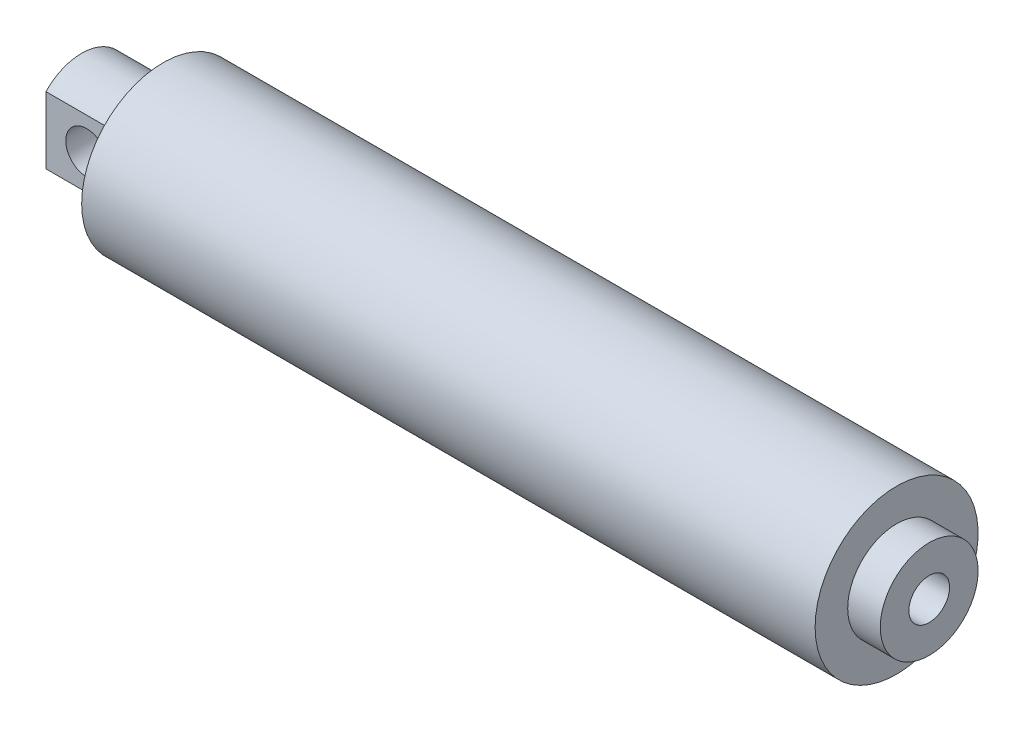
ISO-10303-21;
HEADER;
FILE_DESCRIPTION(('STEP AP214'),'2;1');
FILE_NAME('part.step','',(''),(''),'','','');
FILE_SCHEMA(('AUTOMOTIVE_DESIGN { 1 0 10303 214 1 1 1 1 }'));
ENDSEC;
DATA;
#1=APPLICATION_CONTEXT('core data for automotive mechanical design processes');
#2=APPLICATION_PROTOCOL_DEFINITION('international standard','automotive_design',2000,#1);
#3=PRODUCT_CONTEXT('',#1,'mechanical');
#4=PRODUCT('Part','Part','',(#3));
#5=PRODUCT_RELATED_PRODUCT_CATEGORY('part','',(#4));
#6=PRODUCT_DEFINITION_FORMATION('','',#4);
#7=PRODUCT_DEFINITION_CONTEXT('part definition',#1,'design');
#8=PRODUCT_DEFINITION('design','',#6,#7);
#9=PRODUCT_DEFINITION_SHAPE('','',#8);
#10=(LENGTH_UNIT() NAMED_UNIT(*) SI_UNIT(.MILLI.,.METRE.));
#11=(NAMED_UNIT(*) PLANE_ANGLE_UNIT() SI_UNIT($,.RADIAN.));
#12=(NAMED_UNIT(*) SI_UNIT($,.STERADIAN.) SOLID_ANGLE_UNIT());
#13=UNCERTAINTY_MEASURE_WITH_UNIT(LENGTH_MEASURE(1.E-05),#10,'distance_accuracy_value','');
#14=(GEOMETRIC_REPRESENTATION_CONTEXT(3) GLOBAL_UNCERTAINTY_ASSIGNED_CONTEXT((#13)) GLOBAL_UNIT_ASSIGNED_CONTEXT((#10,
#11,#12)) REPRESENTATION_CONTEXT('',''));
#15=CARTESIAN_POINT('',(0.,0.,0.));
#16=DIRECTION('',(0.,0.,1.));
#17=DIRECTION('',(1.,0.,0.));
#18=AXIS2_PLACEMENT_3D('',#15,#16,#17);
#19=CARTESIAN_POINT('',(-12.7,12.7,0.));
#20=DIRECTION('',(-1.,0.,0.));
#21=DIRECTION('',(0.,0.,1.));
#22=AXIS2_PLACEMENT_3D('',#19,#20,#21);
#23=CYLINDRICAL_SURFACE('',#22,7.62);
#24=DIRECTION('',(-1.,0.,0.));
#25=VECTOR('',#24,1.);
#26=CARTESIAN_POINT('',(-12.7,17.914641496546,-5.55625));
#27=LINE('',#26,#25);
#28=CARTESIAN_POINT('',(-12.7,17.914641496546,-5.55625));
#29=VERTEX_POINT('',#28);
#30=CARTESIAN_POINT('',(0.,17.914641496546,-5.55625));
#31=VERTEX_POINT('',#30);
#32=EDGE_CURVE('E11',#29,#31,#27,.F.);
#33=ORIENTED_EDGE('',*,*,#32,.F.);
#34=CARTESIAN_POINT('',(-12.7,12.7,0.));
#35=DIRECTION('',(-1.,0.,0.));
#36=DIRECTION('',(0.,0.,1.));
#37=AXIS2_PLACEMENT_3D('',#34,#35,#36);
#38=CIRCLE('',#37,7.62);
#39=CARTESIAN_POINT('',(-12.7,17.914641496546,5.55625));
#40=VERTEX_POINT('',#39);
#41=EDGE_CURVE('E90',#40,#29,#38,.T.);
#42=ORIENTED_EDGE('',*,*,#41,.F.);
#43=DIRECTION('',(-1.,0.,0.));
#44=VECTOR('',#43,1.);
#45=CARTESIAN_POINT('',(-12.7,17.914641496546,5.55625));
#46=LINE('',#45,#44);
#47=CARTESIAN_POINT('',(0.,17.914641496546,5.55625));
#48=VERTEX_POINT('',#47);
#49=EDGE_CURVE('E75',#48,#40,#46,.T.);
#50=ORIENTED_EDGE('',*,*,#49,.F.);
#51=CARTESIAN_POINT('',(0.,12.7,0.));
#52=DIRECTION('',(-1.,0.,0.));
#53=DIRECTION('',(0.,0.,1.));
#54=AXIS2_PLACEMENT_3D('',#51,#52,#53);
#55=CIRCLE('',#54,7.62);
#56=EDGE_CURVE('E98',#48,#31,#55,.T.);
#57=ORIENTED_EDGE('',*,*,#56,.T.);
#58=EDGE_LOOP('',(#33,#42,#50,#57));
#59=FACE_BOUND('',#58,.T.);
#60=ADVANCED_FACE('F36',(#59),#23,.T.);
#61=CARTESIAN_POINT('',(-12.7,0.,0.));
#62=DIRECTION('',(-1.,0.,0.));
#63=DIRECTION('',(0.,0.,1.));
#64=AXIS2_PLACEMENT_3D('',#61,#62,#63);
#65=PLANE('',#64);
#66=DIRECTION('',(0.,1.,0.));
#67=VECTOR('',#66,1.);
#68=CARTESIAN_POINT('',(-12.7,20.32,-5.55625));
#69=LINE('',#68,#67);
#70=CARTESIAN_POINT('',(-12.7,7.48535850345395,-5.55625));
#71=VERTEX_POINT('',#70);
#72=EDGE_CURVE('E120',#71,#29,#69,.T.);
#73=ORIENTED_EDGE('',*,*,#72,.F.);
#74=CARTESIAN_POINT('',(-12.7,7.48535850345395,5.55625));
#75=VERTEX_POINT('',#74);
#76=EDGE_CURVE('E92',#71,#75,#38,.T.);
#77=ORIENTED_EDGE('',*,*,#76,.T.);
#78=DIRECTION('',(0.,-1.,0.));
#79=VECTOR('',#78,1.);
#80=CARTESIAN_POINT('',(-12.7,20.32,5.55625));
#81=LINE('',#80,#79);
#82=EDGE_CURVE('E78',#40,#75,#81,.T.);
#83=ORIENTED_EDGE('',*,*,#82,.F.);
#84=ORIENTED_EDGE('',*,*,#41,.T.);
#85=EDGE_LOOP('',(#73,#77,#83,#84));
#86=FACE_BOUND('',#85,.T.);
#87=ADVANCED_FACE('F38',(#86),#65,.T.);
#88=CARTESIAN_POINT('',(119.38,0.,0.));
#89=DIRECTION('',(1.,0.,0.));
#90=DIRECTION('',(0.,0.,-1.));
#91=AXIS2_PLACEMENT_3D('',#88,#89,#90);
#92=PLANE('',#91);
#93=CARTESIAN_POINT('',(119.38,12.7,0.));
#94=DIRECTION('',(1.,0.,0.));
#95=DIRECTION('',(0.,0.,-1.));
#96=AXIS2_PLACEMENT_3D('',#93,#94,#95);
#97=CIRCLE('',#96,3.175);
#98=CARTESIAN_POINT('',(119.38,12.7,-3.175));
#99=VERTEX_POINT('',#98);
#100=EDGE_CURVE('E102',#99,#99,#97,.T.);
#101=ORIENTED_EDGE('',*,*,#100,.F.);
#102=EDGE_LOOP('',(#101));
#103=FACE_BOUND('',#102,.T.);
#104=CARTESIAN_POINT('',(119.38,12.7,0.));
#105=DIRECTION('',(-1.,0.,0.));
#106=DIRECTION('',(0.,0.,1.));
#107=AXIS2_PLACEMENT_3D('',#104,#105,#106);
#108=CIRCLE('',#107,7.62);
#109=CARTESIAN_POINT('',(119.38,12.7,7.62));
#110=VERTEX_POINT('',#109);
#111=EDGE_CURVE('E84',#110,#110,#108,.T.);
#112=ORIENTED_EDGE('',*,*,#111,.F.);
#113=EDGE_LOOP('',(#112));
#114=FACE_BOUND('',#113,.T.);
#115=ADVANCED_FACE('F146',(#103,#114),#92,.T.);
#116=CARTESIAN_POINT('',(-12.7,12.7,0.));
#117=DIRECTION('',(-1.,0.,0.));
#118=DIRECTION('',(0.,0.,1.));
#119=AXIS2_PLACEMENT_3D('',#116,#117,#118);
#120=CYLINDRICAL_SURFACE('',#119,7.62);
#121=ORIENTED_EDGE('',*,*,#111,.T.);
#122=EDGE_LOOP('',(#121));
#123=FACE_BOUND('',#122,.T.);
#124=CARTESIAN_POINT('',(114.3,12.7,0.));
#125=DIRECTION('',(-1.,0.,0.));
#126=DIRECTION('',(0.,0.,1.));
#127=AXIS2_PLACEMENT_3D('',#124,#125,#126);
#128=CIRCLE('',#127,7.62);
#129=CARTESIAN_POINT('',(114.3,12.7,7.62));
#130=VERTEX_POINT('',#129);
#131=EDGE_CURVE('E111',#130,#130,#128,.T.);
#132=ORIENTED_EDGE('',*,*,#131,.F.);
#133=EDGE_LOOP('',(#132));
#134=FACE_BOUND('',#133,.T.);
#135=ADVANCED_FACE('F138',(#123,#134),#120,.T.);
#136=CARTESIAN_POINT('',(114.3,0.,0.));
#137=DIRECTION('',(1.,0.,0.));
#138=DIRECTION('',(0.,0.,-1.));
#139=AXIS2_PLACEMENT_3D('',#136,#137,#138);
#140=PLANE('',#139);
#141=ORIENTED_EDGE('',*,*,#131,.T.);
#142=EDGE_LOOP('',(#141));
#143=FACE_BOUND('',#142,.T.);
#144=CARTESIAN_POINT('',(114.3,12.7,0.));
#145=DIRECTION('',(-1.,0.,0.));
#146=DIRECTION('',(0.,0.,1.));
#147=AXIS2_PLACEMENT_3D('',#144,#145,#146);
#148=CIRCLE('',#147,12.7);
#149=CARTESIAN_POINT('',(114.3,12.7,12.7));
#150=VERTEX_POINT('',#149);
#151=EDGE_CURVE('E108',#150,#150,#148,.T.);
#152=ORIENTED_EDGE('',*,*,#151,.F.);
#153=EDGE_LOOP('',(#152));
#154=FACE_BOUND('',#153,.T.);
#155=ADVANCED_FACE('F132',(#143,#154),#140,.T.);
#156=CARTESIAN_POINT('',(-12.7,12.7,0.));
#157=DIRECTION('',(-1.,0.,0.));
#158=DIRECTION('',(0.,0.,1.));
#159=AXIS2_PLACEMENT_3D('',#156,#157,#158);
#160=CYLINDRICAL_SURFACE('',#159,12.7);
#161=ORIENTED_EDGE('',*,*,#151,.T.);
#162=EDGE_LOOP('',(#161));
#163=FACE_BOUND('',#162,.T.);
#164=CARTESIAN_POINT('',(0.,12.7,0.));
#165=DIRECTION('',(-1.,0.,0.));
#166=DIRECTION('',(0.,0.,1.));
#167=AXIS2_PLACEMENT_3D('',#164,#165,#166);
#168=CIRCLE('',#167,12.7);
#169=CARTESIAN_POINT('',(0.,12.7,12.7));
#170=VERTEX_POINT('',#169);
#171=EDGE_CURVE('E105',#170,#170,#168,.T.);
#172=ORIENTED_EDGE('',*,*,#171,.F.);
#173=EDGE_LOOP('',(#172));
#174=FACE_BOUND('',#173,.T.);
#175=ADVANCED_FACE('F127',(#163,#174),#160,.T.);
#176=CARTESIAN_POINT('',(0.,0.,0.));
#177=DIRECTION('',(-1.,0.,0.));
#178=DIRECTION('',(0.,0.,1.));
#179=AXIS2_PLACEMENT_3D('',#176,#177,#178);
#180=PLANE('',#179);
#181=CARTESIAN_POINT('',(0.,7.48535850345395,-5.55625));
#182=VERTEX_POINT('',#181);
#183=CARTESIAN_POINT('',(0.,7.48535850345395,5.55625));
#184=VERTEX_POINT('',#183);
#185=EDGE_CURVE('E95',#182,#184,#55,.T.);
#186=ORIENTED_EDGE('',*,*,#185,.F.);
#187=DIRECTION('',(0.,1.,0.));
#188=VECTOR('',#187,1.);
#189=CARTESIAN_POINT('',(0.,20.32,-5.55625));
#190=LINE('',#189,#188);
#191=EDGE_CURVE('E57',#182,#31,#190,.T.);
#192=ORIENTED_EDGE('',*,*,#191,.T.);
#193=ORIENTED_EDGE('',*,*,#56,.F.);
#194=DIRECTION('',(0.,-1.,0.));
#195=VECTOR('',#194,1.);
#196=CARTESIAN_POINT('',(0.,20.32,5.55625));
#197=LINE('',#196,#195);
#198=EDGE_CURVE('E52',#48,#184,#197,.T.);
#199=ORIENTED_EDGE('',*,*,#198,.T.);
#200=EDGE_LOOP('',(#186,#192,#193,#199));
#201=FACE_BOUND('',#200,.T.);
#202=ORIENTED_EDGE('',*,*,#171,.T.);
#203=EDGE_LOOP('',(#202));
#204=FACE_BOUND('',#203,.T.);
#205=ADVANCED_FACE('F124',(#201,#204),#180,.T.);
#206=DIRECTION('',(-1.,0.,0.));
#207=VECTOR('',#206,1.);
#208=CARTESIAN_POINT('',(-12.7,7.48535850345395,-5.55625));
#209=LINE('',#208,#207);
#210=EDGE_CURVE('E45',#182,#71,#209,.T.);
#211=ORIENTED_EDGE('',*,*,#210,.F.);
#212=ORIENTED_EDGE('',*,*,#185,.T.);
#213=DIRECTION('',(-1.,0.,0.));
#214=VECTOR('',#213,1.);
#215=CARTESIAN_POINT('',(-12.7,7.48535850345395,5.55625));
#216=LINE('',#215,#214);
#217=EDGE_CURVE('E83',#75,#184,#216,.F.);
#218=ORIENTED_EDGE('',*,*,#217,.F.);
#219=ORIENTED_EDGE('',*,*,#76,.F.);
#220=EDGE_LOOP('',(#211,#212,#218,#219));
#221=FACE_BOUND('',#220,.T.);
#222=ADVANCED_FACE('F123',(#221),#23,.T.);
#223=CARTESIAN_POINT('',(17.78,12.7,0.));
#224=DIRECTION('',(1.,0.,0.));
#225=DIRECTION('',(0.,0.,-1.));
#226=AXIS2_PLACEMENT_3D('',#223,#224,#225);
#227=CYLINDRICAL_SURFACE('',#226,3.175);
#228=CARTESIAN_POINT('',(17.78,12.7,0.));
#229=DIRECTION('',(1.,0.,0.));
#230=DIRECTION('',(0.,0.,-1.));
#231=AXIS2_PLACEMENT_3D('',#228,#229,#230);
#232=CIRCLE('',#231,3.175);
#233=CARTESIAN_POINT('',(17.78,12.7,-3.175));
#234=VERTEX_POINT('',#233);
#235=EDGE_CURVE('E100',#234,#234,#232,.T.);
#236=ORIENTED_EDGE('',*,*,#235,.F.);
#237=EDGE_LOOP('',(#236));
#238=FACE_BOUND('',#237,.T.);
#239=ORIENTED_EDGE('',*,*,#100,.T.);
#240=EDGE_LOOP('',(#239));
#241=FACE_BOUND('',#240,.T.);
#242=ADVANCED_FACE('F149',(#238,#241),#227,.F.);
#243=CARTESIAN_POINT('',(17.78,12.7,0.));
#244=DIRECTION('',(1.,0.,0.));
#245=DIRECTION('',(0.,0.,-1.));
#246=AXIS2_PLACEMENT_3D('',#243,#244,#245);
#247=PLANE('',#246);
#248=ORIENTED_EDGE('',*,*,#235,.T.);
#249=EDGE_LOOP('',(#248));
#250=FACE_BOUND('',#249,.T.);
#251=ADVANCED_FACE('F153',(#250),#247,.T.);
#252=CARTESIAN_POINT('',(0.,20.32,5.55625));
#253=DIRECTION('',(0.,0.,-1.));
#254=DIRECTION('',(0.,1.,0.));
#255=AXIS2_PLACEMENT_3D('',#252,#253,#254);
#256=PLANE('',#255);
#257=CARTESIAN_POINT('',(-6.35,12.834641496546,5.55625));
#258=DIRECTION('',(0.,0.,1.));
#259=DIRECTION('',(1.,0.,0.));
#260=AXIS2_PLACEMENT_3D('',#257,#258,#259);
#261=CIRCLE('',#260,3.2639);
#262=CARTESIAN_POINT('',(-3.0861,12.834641496546,5.55625));
#263=VERTEX_POINT('',#262);
#264=EDGE_CURVE('E177',#263,#263,#261,.T.);
#265=ORIENTED_EDGE('',*,*,#264,.F.);
#266=EDGE_LOOP('',(#265));
#267=FACE_BOUND('',#266,.T.);
#268=ORIENTED_EDGE('',*,*,#217,.T.);
#269=ORIENTED_EDGE('',*,*,#198,.F.);
#270=ORIENTED_EDGE('',*,*,#49,.T.);
#271=ORIENTED_EDGE('',*,*,#82,.T.);
#272=EDGE_LOOP('',(#268,#269,#270,#271));
#273=FACE_BOUND('',#272,.T.);
#274=ADVANCED_FACE('F77',(#267,#273),#256,.F.);
#275=CARTESIAN_POINT('',(0.,20.32,-5.55625));
#276=DIRECTION('',(0.,0.,1.));
#277=DIRECTION('',(0.,-1.,0.));
#278=AXIS2_PLACEMENT_3D('',#275,#276,#277);
#279=PLANE('',#278);
#280=CARTESIAN_POINT('',(-6.35,12.834641496546,-5.55625));
#281=DIRECTION('',(0.,0.,1.));
#282=DIRECTION('',(0.,-1.,0.));
#283=AXIS2_PLACEMENT_3D('',#280,#281,#282);
#284=CIRCLE('',#283,3.2639);
#285=CARTESIAN_POINT('',(-6.35,9.57074149654604,-5.55625));
#286=VERTEX_POINT('',#285);
#287=EDGE_CURVE('E40',#286,#286,#284,.T.);
#288=ORIENTED_EDGE('',*,*,#287,.T.);
#289=EDGE_LOOP('',(#288));
#290=FACE_BOUND('',#289,.T.);
#291=ORIENTED_EDGE('',*,*,#32,.T.);
#292=ORIENTED_EDGE('',*,*,#191,.F.);
#293=ORIENTED_EDGE('',*,*,#210,.T.);
#294=ORIENTED_EDGE('',*,*,#72,.T.);
#295=EDGE_LOOP('',(#291,#292,#293,#294));
#296=FACE_BOUND('',#295,.T.);
#297=ADVANCED_FACE('F119',(#290,#296),#279,.F.);
#298=CARTESIAN_POINT('',(-6.35,12.834641496546,-12.7));
#299=DIRECTION('',(0.,0.,1.));
#300=DIRECTION('',(1.,0.,0.));
#301=AXIS2_PLACEMENT_3D('',#298,#299,#300);
#302=CYLINDRICAL_SURFACE('',#301,3.2639);
#303=ORIENTED_EDGE('',*,*,#264,.T.);
#304=EDGE_LOOP('',(#303));
#305=FACE_BOUND('',#304,.T.);
#306=ORIENTED_EDGE('',*,*,#287,.F.);
#307=EDGE_LOOP('',(#306));
#308=FACE_BOUND('',#307,.T.);
#309=ADVANCED_FACE('F168',(#305,#308),#302,.F.);
#310=CLOSED_SHELL('',(#60,#87,#115,#135,#155,#175,#205,#222,#242,#251,#274,#297,#309));
#311=MANIFOLD_SOLID_BREP('B2',#310);
#312=ADVANCED_BREP_SHAPE_REPRESENTATION('',(#18,#311),#14);
#313=SHAPE_DEFINITION_REPRESENTATION(#9,#312);
ENDSEC;
END-ISO-10303-21;
